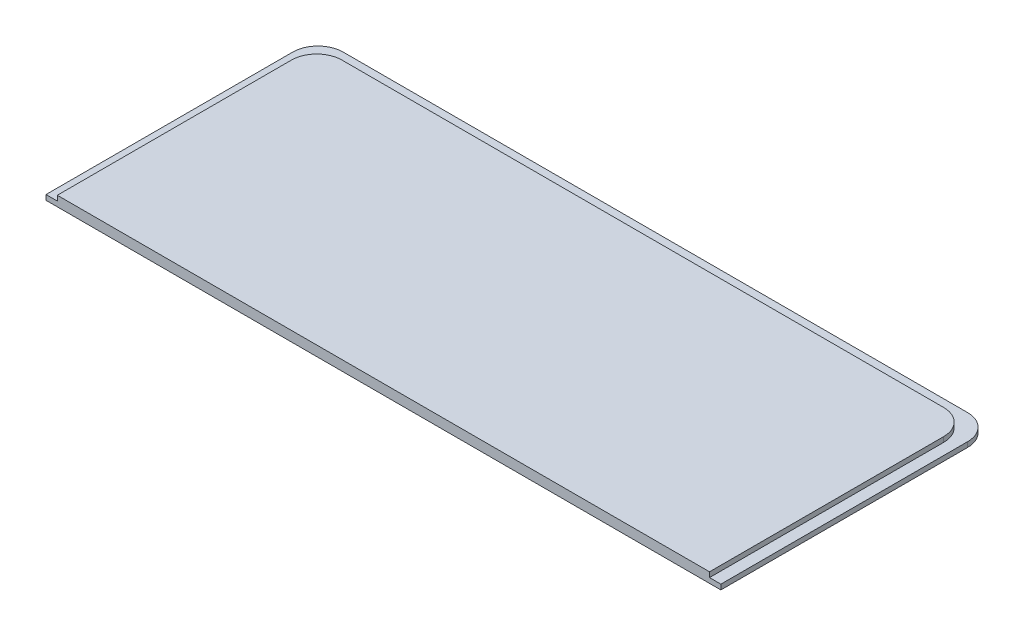
ISO-10303-21;
HEADER;
FILE_DESCRIPTION(('STEP AP214'),'2;1');
FILE_NAME('part.step','',(''),(''),'','','');
FILE_SCHEMA(('AUTOMOTIVE_DESIGN { 1 0 10303 214 1 1 1 1 }'));
ENDSEC;
DATA;
#1=APPLICATION_CONTEXT('core data for automotive mechanical design processes');
#2=APPLICATION_PROTOCOL_DEFINITION('international standard','automotive_design',2000,#1);
#3=PRODUCT_CONTEXT('',#1,'mechanical');
#4=PRODUCT('Part','Part','',(#3));
#5=PRODUCT_RELATED_PRODUCT_CATEGORY('part','',(#4));
#6=PRODUCT_DEFINITION_FORMATION('','',#4);
#7=PRODUCT_DEFINITION_CONTEXT('part definition',#1,'design');
#8=PRODUCT_DEFINITION('design','',#6,#7);
#9=PRODUCT_DEFINITION_SHAPE('','',#8);
#10=(LENGTH_UNIT() NAMED_UNIT(*) SI_UNIT(.MILLI.,.METRE.));
#11=(NAMED_UNIT(*) PLANE_ANGLE_UNIT() SI_UNIT($,.RADIAN.));
#12=(NAMED_UNIT(*) SI_UNIT($,.STERADIAN.) SOLID_ANGLE_UNIT());
#13=UNCERTAINTY_MEASURE_WITH_UNIT(LENGTH_MEASURE(1.E-05),#10,'distance_accuracy_value','');
#14=(GEOMETRIC_REPRESENTATION_CONTEXT(3) GLOBAL_UNCERTAINTY_ASSIGNED_CONTEXT((#13)) GLOBAL_UNIT_ASSIGNED_CONTEXT((#10,
#11,#12)) REPRESENTATION_CONTEXT('',''));
#15=CARTESIAN_POINT('',(0.,0.,0.));
#16=DIRECTION('',(0.,0.,1.));
#17=DIRECTION('',(1.,0.,0.));
#18=AXIS2_PLACEMENT_3D('',#15,#16,#17);
#19=CARTESIAN_POINT('',(64.75,2.,-20.75));
#20=DIRECTION('',(-1.,0.,0.));
#21=DIRECTION('',(0.,0.,1.));
#22=AXIS2_PLACEMENT_3D('',#19,#20,#21);
#23=PLANE('',#22);
#24=DIRECTION('',(0.,0.,1.));
#25=VECTOR('',#24,1.);
#26=CARTESIAN_POINT('',(64.75,1.,-20.75));
#27=LINE('',#26,#25);
#28=CARTESIAN_POINT('',(64.75,1.,-20.75));
#29=VERTEX_POINT('',#28);
#30=CARTESIAN_POINT('',(64.75,1.,25.75));
#31=VERTEX_POINT('',#30);
#32=EDGE_CURVE('E47',#29,#31,#27,.T.);
#33=ORIENTED_EDGE('',*,*,#32,.F.);
#34=DIRECTION('',(0.,-1.,0.));
#35=VECTOR('',#34,1.);
#36=CARTESIAN_POINT('',(64.75,2.,-20.75));
#37=LINE('',#36,#35);
#38=CARTESIAN_POINT('',(64.75,2.,-20.75));
#39=VERTEX_POINT('',#38);
#40=EDGE_CURVE('E11',#39,#29,#37,.T.);
#41=ORIENTED_EDGE('',*,*,#40,.F.);
#42=DIRECTION('',(0.,0.,-1.));
#43=VECTOR('',#42,1.);
#44=CARTESIAN_POINT('',(64.75,2.,-20.75));
#45=LINE('',#44,#43);
#46=CARTESIAN_POINT('',(64.75,2.,25.75));
#47=VERTEX_POINT('',#46);
#48=EDGE_CURVE('E168',#47,#39,#45,.T.);
#49=ORIENTED_EDGE('',*,*,#48,.F.);
#50=DIRECTION('',(0.,-1.,0.));
#51=VECTOR('',#50,1.);
#52=CARTESIAN_POINT('',(64.75,2.,25.75));
#53=LINE('',#52,#51);
#54=EDGE_CURVE('E181',#47,#31,#53,.T.);
#55=ORIENTED_EDGE('',*,*,#54,.T.);
#56=EDGE_LOOP('',(#33,#41,#49,#55));
#57=FACE_BOUND('',#56,.T.);
#58=ADVANCED_FACE('F33',(#57),#23,.F.);
#59=CARTESIAN_POINT('',(59.75,2.,-20.75));
#60=DIRECTION('',(0.,-1.,0.));
#61=DIRECTION('',(0.,0.,-1.));
#62=AXIS2_PLACEMENT_3D('',#59,#60,#61);
#63=CYLINDRICAL_SURFACE('',#62,5.);
#64=CARTESIAN_POINT('',(59.75,1.,-20.75));
#65=DIRECTION('',(0.,-1.,0.));
#66=DIRECTION('',(0.,0.,-1.));
#67=AXIS2_PLACEMENT_3D('',#64,#65,#66);
#68=CIRCLE('',#67,5.);
#69=CARTESIAN_POINT('',(59.75,1.,-25.75));
#70=VERTEX_POINT('',#69);
#71=EDGE_CURVE('E53',#70,#29,#68,.T.);
#72=ORIENTED_EDGE('',*,*,#71,.F.);
#73=DIRECTION('',(0.,-1.,0.));
#74=VECTOR('',#73,1.);
#75=CARTESIAN_POINT('',(59.75,2.,-25.75));
#76=LINE('',#75,#74);
#77=CARTESIAN_POINT('',(59.75,2.,-25.75));
#78=VERTEX_POINT('',#77);
#79=EDGE_CURVE('E40',#78,#70,#76,.T.);
#80=ORIENTED_EDGE('',*,*,#79,.F.);
#81=CARTESIAN_POINT('',(59.75,2.,-20.75));
#82=DIRECTION('',(0.,1.,0.));
#83=DIRECTION('',(0.,0.,-1.));
#84=AXIS2_PLACEMENT_3D('',#81,#82,#83);
#85=CIRCLE('',#84,5.);
#86=EDGE_CURVE('E171',#39,#78,#85,.T.);
#87=ORIENTED_EDGE('',*,*,#86,.F.);
#88=ORIENTED_EDGE('',*,*,#40,.T.);
#89=EDGE_LOOP('',(#72,#80,#87,#88));
#90=FACE_BOUND('',#89,.T.);
#91=ADVANCED_FACE('F205',(#90),#63,.T.);
#92=CARTESIAN_POINT('',(-59.75,2.,-25.75));
#93=DIRECTION('',(0.,0.,1.));
#94=DIRECTION('',(1.,0.,0.));
#95=AXIS2_PLACEMENT_3D('',#92,#93,#94);
#96=PLANE('',#95);
#97=DIRECTION('',(1.,0.,0.));
#98=VECTOR('',#97,1.);
#99=CARTESIAN_POINT('',(-59.75,1.,-25.75));
#100=LINE('',#99,#98);
#101=CARTESIAN_POINT('',(-59.75,1.,-25.75));
#102=VERTEX_POINT('',#101);
#103=EDGE_CURVE('E162',#102,#70,#100,.T.);
#104=ORIENTED_EDGE('',*,*,#103,.F.);
#105=DIRECTION('',(0.,-1.,0.));
#106=VECTOR('',#105,1.);
#107=CARTESIAN_POINT('',(-59.75,2.,-25.75));
#108=LINE('',#107,#106);
#109=CARTESIAN_POINT('',(-59.75,2.,-25.75));
#110=VERTEX_POINT('',#109);
#111=EDGE_CURVE('E188',#110,#102,#108,.T.);
#112=ORIENTED_EDGE('',*,*,#111,.F.);
#113=DIRECTION('',(-1.,0.,0.));
#114=VECTOR('',#113,1.);
#115=CARTESIAN_POINT('',(-59.75,2.,-25.75));
#116=LINE('',#115,#114);
#117=EDGE_CURVE('E173',#78,#110,#116,.T.);
#118=ORIENTED_EDGE('',*,*,#117,.F.);
#119=ORIENTED_EDGE('',*,*,#79,.T.);
#120=EDGE_LOOP('',(#104,#112,#118,#119));
#121=FACE_BOUND('',#120,.T.);
#122=ADVANCED_FACE('F192',(#121),#96,.F.);
#123=CARTESIAN_POINT('',(-59.75,2.,-20.75));
#124=DIRECTION('',(0.,-1.,0.));
#125=DIRECTION('',(0.,0.,-1.));
#126=AXIS2_PLACEMENT_3D('',#123,#124,#125);
#127=CYLINDRICAL_SURFACE('',#126,5.);
#128=CARTESIAN_POINT('',(-59.75,1.,-20.75));
#129=DIRECTION('',(0.,-1.,0.));
#130=DIRECTION('',(0.,0.,-1.));
#131=AXIS2_PLACEMENT_3D('',#128,#129,#130);
#132=CIRCLE('',#131,5.);
#133=CARTESIAN_POINT('',(-64.75,1.,-20.75));
#134=VERTEX_POINT('',#133);
#135=EDGE_CURVE('E153',#134,#102,#132,.T.);
#136=ORIENTED_EDGE('',*,*,#135,.F.);
#137=DIRECTION('',(0.,-1.,0.));
#138=VECTOR('',#137,1.);
#139=CARTESIAN_POINT('',(-64.75,2.,-20.75));
#140=LINE('',#139,#138);
#141=CARTESIAN_POINT('',(-64.75,2.,-20.75));
#142=VERTEX_POINT('',#141);
#143=EDGE_CURVE('E185',#142,#134,#140,.T.);
#144=ORIENTED_EDGE('',*,*,#143,.F.);
#145=CARTESIAN_POINT('',(-59.75,2.,-20.75));
#146=DIRECTION('',(0.,1.,0.));
#147=DIRECTION('',(0.,0.,1.));
#148=AXIS2_PLACEMENT_3D('',#145,#146,#147);
#149=CIRCLE('',#148,5.);
#150=EDGE_CURVE('E175',#110,#142,#149,.T.);
#151=ORIENTED_EDGE('',*,*,#150,.F.);
#152=ORIENTED_EDGE('',*,*,#111,.T.);
#153=EDGE_LOOP('',(#136,#144,#151,#152));
#154=FACE_BOUND('',#153,.T.);
#155=ADVANCED_FACE('F196',(#154),#127,.T.);
#156=CARTESIAN_POINT('',(-64.75,2.,-20.75));
#157=DIRECTION('',(1.,0.,0.));
#158=DIRECTION('',(0.,0.,-1.));
#159=AXIS2_PLACEMENT_3D('',#156,#157,#158);
#160=PLANE('',#159);
#161=DIRECTION('',(0.,0.,-1.));
#162=VECTOR('',#161,1.);
#163=CARTESIAN_POINT('',(-64.75,1.,-20.75));
#164=LINE('',#163,#162);
#165=CARTESIAN_POINT('',(-64.75,1.,25.75));
#166=VERTEX_POINT('',#165);
#167=EDGE_CURVE('E150',#166,#134,#164,.T.);
#168=ORIENTED_EDGE('',*,*,#167,.F.);
#169=DIRECTION('',(0.,-1.,0.));
#170=VECTOR('',#169,1.);
#171=CARTESIAN_POINT('',(-64.75,2.,25.75));
#172=LINE('',#171,#170);
#173=CARTESIAN_POINT('',(-64.75,2.,25.75));
#174=VERTEX_POINT('',#173);
#175=EDGE_CURVE('E131',#174,#166,#172,.T.);
#176=ORIENTED_EDGE('',*,*,#175,.F.);
#177=DIRECTION('',(0.,0.,1.));
#178=VECTOR('',#177,1.);
#179=CARTESIAN_POINT('',(-64.75,2.,-20.75));
#180=LINE('',#179,#178);
#181=EDGE_CURVE('E177',#142,#174,#180,.T.);
#182=ORIENTED_EDGE('',*,*,#181,.F.);
#183=ORIENTED_EDGE('',*,*,#143,.T.);
#184=EDGE_LOOP('',(#168,#176,#182,#183));
#185=FACE_BOUND('',#184,.T.);
#186=ADVANCED_FACE('F200',(#185),#160,.F.);
#187=CARTESIAN_POINT('',(-64.75,2.,25.75));
#188=DIRECTION('',(0.,0.,-1.));
#189=DIRECTION('',(-1.,0.,0.));
#190=AXIS2_PLACEMENT_3D('',#187,#188,#189);
#191=PLANE('',#190);
#192=DIRECTION('',(1.,0.,0.));
#193=VECTOR('',#192,1.);
#194=CARTESIAN_POINT('',(-64.75,0.,25.75));
#195=LINE('',#194,#193);
#196=CARTESIAN_POINT('',(-67.,0.,25.75));
#197=VERTEX_POINT('',#196);
#198=CARTESIAN_POINT('',(67.,0.,25.75));
#199=VERTEX_POINT('',#198);
#200=EDGE_CURVE('E167',#197,#199,#195,.T.);
#201=ORIENTED_EDGE('',*,*,#200,.T.);
#202=DIRECTION('',(0.,-1.,0.));
#203=VECTOR('',#202,1.);
#204=CARTESIAN_POINT('',(67.,1.,25.75));
#205=LINE('',#204,#203);
#206=CARTESIAN_POINT('',(67.,1.,25.75));
#207=VERTEX_POINT('',#206);
#208=EDGE_CURVE('E151',#207,#199,#205,.T.);
#209=ORIENTED_EDGE('',*,*,#208,.F.);
#210=DIRECTION('',(1.,0.,0.));
#211=VECTOR('',#210,1.);
#212=CARTESIAN_POINT('',(-67.,1.,25.75));
#213=LINE('',#212,#211);
#214=EDGE_CURVE('E135',#31,#207,#213,.T.);
#215=ORIENTED_EDGE('',*,*,#214,.F.);
#216=ORIENTED_EDGE('',*,*,#54,.F.);
#217=DIRECTION('',(1.,0.,0.));
#218=VECTOR('',#217,1.);
#219=CARTESIAN_POINT('',(-64.75,2.,25.75));
#220=LINE('',#219,#218);
#221=EDGE_CURVE('E179',#174,#47,#220,.T.);
#222=ORIENTED_EDGE('',*,*,#221,.F.);
#223=ORIENTED_EDGE('',*,*,#175,.T.);
#224=CARTESIAN_POINT('',(-67.,1.,25.75));
#225=VERTEX_POINT('',#224);
#226=EDGE_CURVE('E123',#225,#166,#213,.T.);
#227=ORIENTED_EDGE('',*,*,#226,.F.);
#228=DIRECTION('',(0.,-1.,0.));
#229=VECTOR('',#228,1.);
#230=CARTESIAN_POINT('',(-67.,1.,25.75));
#231=LINE('',#230,#229);
#232=EDGE_CURVE('E127',#225,#197,#231,.T.);
#233=ORIENTED_EDGE('',*,*,#232,.T.);
#234=EDGE_LOOP('',(#201,#209,#215,#216,#222,#223,#227,#233));
#235=FACE_BOUND('',#234,.T.);
#236=ADVANCED_FACE('F125',(#235),#191,.F.);
#237=CARTESIAN_POINT('',(-59.75,2.,-20.75));
#238=DIRECTION('',(0.,1.,0.));
#239=DIRECTION('',(0.,0.,1.));
#240=AXIS2_PLACEMENT_3D('',#237,#238,#239);
#241=PLANE('',#240);
#242=ORIENTED_EDGE('',*,*,#48,.T.);
#243=ORIENTED_EDGE('',*,*,#86,.T.);
#244=ORIENTED_EDGE('',*,*,#117,.T.);
#245=ORIENTED_EDGE('',*,*,#150,.T.);
#246=ORIENTED_EDGE('',*,*,#181,.T.);
#247=ORIENTED_EDGE('',*,*,#221,.T.);
#248=EDGE_LOOP('',(#242,#243,#244,#245,#246,#247));
#249=FACE_BOUND('',#248,.T.);
#250=ADVANCED_FACE('F202',(#249),#241,.T.);
#251=CARTESIAN_POINT('',(-59.75,0.,-20.75));
#252=DIRECTION('',(0.,1.,0.));
#253=DIRECTION('',(0.,0.,1.));
#254=AXIS2_PLACEMENT_3D('',#251,#252,#253);
#255=PLANE('',#254);
#256=DIRECTION('',(0.,0.,-1.));
#257=VECTOR('',#256,1.);
#258=CARTESIAN_POINT('',(67.,0.,25.75));
#259=LINE('',#258,#257);
#260=CARTESIAN_POINT('',(67.,0.,-23.25));
#261=VERTEX_POINT('',#260);
#262=EDGE_CURVE('E218',#199,#261,#259,.T.);
#263=ORIENTED_EDGE('',*,*,#262,.F.);
#264=ORIENTED_EDGE('',*,*,#200,.F.);
#265=DIRECTION('',(0.,0.,1.));
#266=VECTOR('',#265,1.);
#267=CARTESIAN_POINT('',(-67.,0.,25.75));
#268=LINE('',#267,#266);
#269=CARTESIAN_POINT('',(-67.,0.,-23.25));
#270=VERTEX_POINT('',#269);
#271=EDGE_CURVE('E149',#270,#197,#268,.T.);
#272=ORIENTED_EDGE('',*,*,#271,.F.);
#273=CARTESIAN_POINT('',(-62.,0.,-23.25));
#274=DIRECTION('',(0.,1.,0.));
#275=DIRECTION('',(0.,0.,-1.));
#276=AXIS2_PLACEMENT_3D('',#273,#274,#275);
#277=CIRCLE('',#276,5.);
#278=CARTESIAN_POINT('',(-62.,0.,-28.25));
#279=VERTEX_POINT('',#278);
#280=EDGE_CURVE('E145',#279,#270,#277,.T.);
#281=ORIENTED_EDGE('',*,*,#280,.F.);
#282=DIRECTION('',(-1.,0.,0.));
#283=VECTOR('',#282,1.);
#284=CARTESIAN_POINT('',(-62.,0.,-28.25));
#285=LINE('',#284,#283);
#286=CARTESIAN_POINT('',(62.,0.,-28.25));
#287=VERTEX_POINT('',#286);
#288=EDGE_CURVE('E222',#287,#279,#285,.T.);
#289=ORIENTED_EDGE('',*,*,#288,.F.);
#290=CARTESIAN_POINT('',(62.,0.,-23.25));
#291=DIRECTION('',(0.,1.,0.));
#292=DIRECTION('',(0.,0.,-1.));
#293=AXIS2_PLACEMENT_3D('',#290,#291,#292);
#294=CIRCLE('',#293,5.);
#295=EDGE_CURVE('E220',#261,#287,#294,.T.);
#296=ORIENTED_EDGE('',*,*,#295,.F.);
#297=EDGE_LOOP('',(#263,#264,#272,#281,#289,#296));
#298=FACE_BOUND('',#297,.T.);
#299=ADVANCED_FACE('F242',(#298),#255,.F.);
#300=CARTESIAN_POINT('',(-62.,1.,-23.25));
#301=DIRECTION('',(0.,-1.,0.));
#302=DIRECTION('',(0.,0.,-1.));
#303=AXIS2_PLACEMENT_3D('',#300,#301,#302);
#304=PLANE('',#303);
#305=ORIENTED_EDGE('',*,*,#71,.T.);
#306=ORIENTED_EDGE('',*,*,#32,.T.);
#307=ORIENTED_EDGE('',*,*,#214,.T.);
#308=DIRECTION('',(0.,0.,-1.));
#309=VECTOR('',#308,1.);
#310=CARTESIAN_POINT('',(67.,1.,25.75));
#311=LINE('',#310,#309);
#312=CARTESIAN_POINT('',(67.,1.,-23.25));
#313=VERTEX_POINT('',#312);
#314=EDGE_CURVE('E134',#207,#313,#311,.T.);
#315=ORIENTED_EDGE('',*,*,#314,.T.);
#316=CARTESIAN_POINT('',(62.,1.,-23.25));
#317=DIRECTION('',(0.,1.,0.));
#318=DIRECTION('',(0.,0.,-1.));
#319=AXIS2_PLACEMENT_3D('',#316,#317,#318);
#320=CIRCLE('',#319,5.);
#321=CARTESIAN_POINT('',(62.,1.,-28.25));
#322=VERTEX_POINT('',#321);
#323=EDGE_CURVE('E211',#313,#322,#320,.T.);
#324=ORIENTED_EDGE('',*,*,#323,.T.);
#325=DIRECTION('',(-1.,0.,0.));
#326=VECTOR('',#325,1.);
#327=CARTESIAN_POINT('',(-62.,1.,-28.25));
#328=LINE('',#327,#326);
#329=CARTESIAN_POINT('',(-62.,1.,-28.25));
#330=VERTEX_POINT('',#329);
#331=EDGE_CURVE('E213',#322,#330,#328,.T.);
#332=ORIENTED_EDGE('',*,*,#331,.T.);
#333=CARTESIAN_POINT('',(-62.,1.,-23.25));
#334=DIRECTION('',(0.,1.,0.));
#335=DIRECTION('',(0.,0.,-1.));
#336=AXIS2_PLACEMENT_3D('',#333,#334,#335);
#337=CIRCLE('',#336,5.);
#338=CARTESIAN_POINT('',(-67.,1.,-23.25));
#339=VERTEX_POINT('',#338);
#340=EDGE_CURVE('E141',#330,#339,#337,.T.);
#341=ORIENTED_EDGE('',*,*,#340,.T.);
#342=DIRECTION('',(0.,0.,1.));
#343=VECTOR('',#342,1.);
#344=CARTESIAN_POINT('',(-67.,1.,25.75));
#345=LINE('',#344,#343);
#346=EDGE_CURVE('E138',#339,#225,#345,.T.);
#347=ORIENTED_EDGE('',*,*,#346,.T.);
#348=ORIENTED_EDGE('',*,*,#226,.T.);
#349=ORIENTED_EDGE('',*,*,#167,.T.);
#350=ORIENTED_EDGE('',*,*,#135,.T.);
#351=ORIENTED_EDGE('',*,*,#103,.T.);
#352=EDGE_LOOP('',(#305,#306,#307,#315,#324,#332,#341,#347,#348,#349,#350,#351));
#353=FACE_BOUND('',#352,.T.);
#354=ADVANCED_FACE('F139',(#353),#304,.F.);
#355=CARTESIAN_POINT('',(-67.,1.,25.75));
#356=DIRECTION('',(1.,0.,0.));
#357=DIRECTION('',(0.,0.,-1.));
#358=AXIS2_PLACEMENT_3D('',#355,#356,#357);
#359=PLANE('',#358);
#360=ORIENTED_EDGE('',*,*,#271,.T.);
#361=ORIENTED_EDGE('',*,*,#232,.F.);
#362=ORIENTED_EDGE('',*,*,#346,.F.);
#363=DIRECTION('',(0.,-1.,0.));
#364=VECTOR('',#363,1.);
#365=CARTESIAN_POINT('',(-67.,1.,-23.25));
#366=LINE('',#365,#364);
#367=EDGE_CURVE('E216',#339,#270,#366,.T.);
#368=ORIENTED_EDGE('',*,*,#367,.T.);
#369=EDGE_LOOP('',(#360,#361,#362,#368));
#370=FACE_BOUND('',#369,.T.);
#371=ADVANCED_FACE('F147',(#370),#359,.F.);
#372=CARTESIAN_POINT('',(67.,1.,25.75));
#373=DIRECTION('',(-1.,0.,0.));
#374=DIRECTION('',(0.,0.,1.));
#375=AXIS2_PLACEMENT_3D('',#372,#373,#374);
#376=PLANE('',#375);
#377=ORIENTED_EDGE('',*,*,#262,.T.);
#378=DIRECTION('',(0.,-1.,0.));
#379=VECTOR('',#378,1.);
#380=CARTESIAN_POINT('',(67.,1.,-23.25));
#381=LINE('',#380,#379);
#382=EDGE_CURVE('E156',#313,#261,#381,.T.);
#383=ORIENTED_EDGE('',*,*,#382,.F.);
#384=ORIENTED_EDGE('',*,*,#314,.F.);
#385=ORIENTED_EDGE('',*,*,#208,.T.);
#386=EDGE_LOOP('',(#377,#383,#384,#385));
#387=FACE_BOUND('',#386,.T.);
#388=ADVANCED_FACE('F250',(#387),#376,.F.);
#389=CARTESIAN_POINT('',(62.,1.,-23.25));
#390=DIRECTION('',(0.,-1.,0.));
#391=DIRECTION('',(0.,0.,-1.));
#392=AXIS2_PLACEMENT_3D('',#389,#390,#391);
#393=CYLINDRICAL_SURFACE('',#392,5.);
#394=ORIENTED_EDGE('',*,*,#295,.T.);
#395=DIRECTION('',(0.,-1.,0.));
#396=VECTOR('',#395,1.);
#397=CARTESIAN_POINT('',(62.,1.,-28.25));
#398=LINE('',#397,#396);
#399=EDGE_CURVE('E229',#322,#287,#398,.T.);
#400=ORIENTED_EDGE('',*,*,#399,.F.);
#401=ORIENTED_EDGE('',*,*,#323,.F.);
#402=ORIENTED_EDGE('',*,*,#382,.T.);
#403=EDGE_LOOP('',(#394,#400,#401,#402));
#404=FACE_BOUND('',#403,.T.);
#405=ADVANCED_FACE('F236',(#404),#393,.T.);
#406=CARTESIAN_POINT('',(-62.,1.,-28.25));
#407=DIRECTION('',(0.,0.,1.));
#408=DIRECTION('',(1.,0.,0.));
#409=AXIS2_PLACEMENT_3D('',#406,#407,#408);
#410=PLANE('',#409);
#411=ORIENTED_EDGE('',*,*,#288,.T.);
#412=DIRECTION('',(0.,-1.,0.));
#413=VECTOR('',#412,1.);
#414=CARTESIAN_POINT('',(-62.,1.,-28.25));
#415=LINE('',#414,#413);
#416=EDGE_CURVE('E226',#330,#279,#415,.T.);
#417=ORIENTED_EDGE('',*,*,#416,.F.);
#418=ORIENTED_EDGE('',*,*,#331,.F.);
#419=ORIENTED_EDGE('',*,*,#399,.T.);
#420=EDGE_LOOP('',(#411,#417,#418,#419));
#421=FACE_BOUND('',#420,.T.);
#422=ADVANCED_FACE('F246',(#421),#410,.F.);
#423=CARTESIAN_POINT('',(-62.,1.,-23.25));
#424=DIRECTION('',(0.,-1.,0.));
#425=DIRECTION('',(0.,0.,-1.));
#426=AXIS2_PLACEMENT_3D('',#423,#424,#425);
#427=CYLINDRICAL_SURFACE('',#426,5.);
#428=ORIENTED_EDGE('',*,*,#280,.T.);
#429=ORIENTED_EDGE('',*,*,#367,.F.);
#430=ORIENTED_EDGE('',*,*,#340,.F.);
#431=ORIENTED_EDGE('',*,*,#416,.T.);
#432=EDGE_LOOP('',(#428,#429,#430,#431));
#433=FACE_BOUND('',#432,.T.);
#434=ADVANCED_FACE('F249',(#433),#427,.T.);
#435=CLOSED_SHELL('',(#58,#91,#122,#155,#186,#236,#250,#299,#354,#371,#388,#405,#422,#434));
#436=MANIFOLD_SOLID_BREP('B2',#435);
#437=ADVANCED_BREP_SHAPE_REPRESENTATION('',(#18,#436),#14);
#438=SHAPE_DEFINITION_REPRESENTATION(#9,#437);
ENDSEC;
END-ISO-10303-21;
